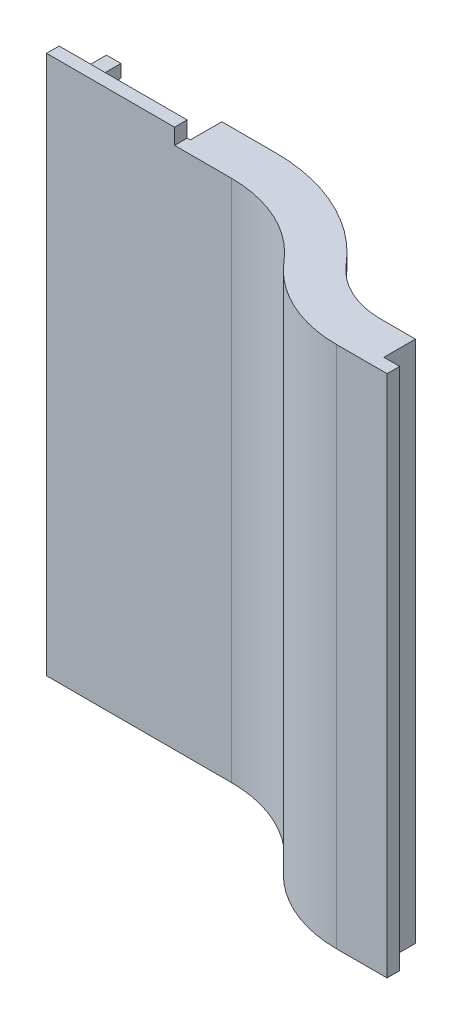
ISO-10303-21;
HEADER;
FILE_DESCRIPTION(('STEP AP214'),'2;1');
FILE_NAME('part.step','',(''),(''),'','','');
FILE_SCHEMA(('AUTOMOTIVE_DESIGN { 1 0 10303 214 1 1 1 1 }'));
ENDSEC;
DATA;
#1=APPLICATION_CONTEXT('core data for automotive mechanical design processes');
#2=APPLICATION_PROTOCOL_DEFINITION('international standard','automotive_design',2000,#1);
#3=PRODUCT_CONTEXT('',#1,'mechanical');
#4=PRODUCT('Part','Part','',(#3));
#5=PRODUCT_RELATED_PRODUCT_CATEGORY('part','',(#4));
#6=PRODUCT_DEFINITION_FORMATION('','',#4);
#7=PRODUCT_DEFINITION_CONTEXT('part definition',#1,'design');
#8=PRODUCT_DEFINITION('design','',#6,#7);
#9=PRODUCT_DEFINITION_SHAPE('','',#8);
#10=(LENGTH_UNIT() NAMED_UNIT(*) SI_UNIT(.MILLI.,.METRE.));
#11=(NAMED_UNIT(*) PLANE_ANGLE_UNIT() SI_UNIT($,.RADIAN.));
#12=(NAMED_UNIT(*) SI_UNIT($,.STERADIAN.) SOLID_ANGLE_UNIT());
#13=UNCERTAINTY_MEASURE_WITH_UNIT(LENGTH_MEASURE(1.E-05),#10,'distance_accuracy_value','');
#14=(GEOMETRIC_REPRESENTATION_CONTEXT(3) GLOBAL_UNCERTAINTY_ASSIGNED_CONTEXT((#13)) GLOBAL_UNIT_ASSIGNED_CONTEXT((#10,
#11,#12)) REPRESENTATION_CONTEXT('',''));
#15=CARTESIAN_POINT('',(0.,0.,0.));
#16=DIRECTION('',(0.,0.,1.));
#17=DIRECTION('',(1.,0.,0.));
#18=AXIS2_PLACEMENT_3D('',#15,#16,#17);
#19=CARTESIAN_POINT('',(-3.,80.5,151.017935777165));
#20=DIRECTION('',(0.,-1.,0.));
#21=DIRECTION('',(0.,0.,-1.));
#22=AXIS2_PLACEMENT_3D('',#19,#20,#21);
#23=PLANE('',#22);
#24=DIRECTION('',(-1.,0.,0.));
#25=VECTOR('',#24,1.);
#26=CARTESIAN_POINT('',(15.3,80.5,18.));
#27=LINE('',#26,#25);
#28=CARTESIAN_POINT('',(-0.199999999999999,80.5,18.));
#29=VERTEX_POINT('',#28);
#30=CARTESIAN_POINT('',(-2.5,80.5,18.));
#31=VERTEX_POINT('',#30);
#32=EDGE_CURVE('E37',#29,#31,#27,.T.);
#33=ORIENTED_EDGE('',*,*,#32,.F.);
#34=DIRECTION('',(0.,0.,1.));
#35=VECTOR('',#34,1.);
#36=CARTESIAN_POINT('',(-0.2,80.5,13.));
#37=LINE('',#36,#35);
#38=CARTESIAN_POINT('',(-0.2,80.5,13.));
#39=VERTEX_POINT('',#38);
#40=EDGE_CURVE('E58',#39,#29,#37,.T.);
#41=ORIENTED_EDGE('',*,*,#40,.F.);
#42=DIRECTION('',(1.,0.,0.));
#43=VECTOR('',#42,1.);
#44=CARTESIAN_POINT('',(-2.5,80.5,13.));
#45=LINE('',#44,#43);
#46=CARTESIAN_POINT('',(-2.5,80.5,13.));
#47=VERTEX_POINT('',#46);
#48=EDGE_CURVE('E531',#47,#39,#45,.T.);
#49=ORIENTED_EDGE('',*,*,#48,.F.);
#50=DIRECTION('',(0.,0.,1.));
#51=VECTOR('',#50,1.);
#52=CARTESIAN_POINT('',(-2.5,80.5,13.));
#53=LINE('',#52,#51);
#54=EDGE_CURVE('E506',#47,#31,#53,.T.);
#55=ORIENTED_EDGE('',*,*,#54,.T.);
#56=EDGE_LOOP('',(#33,#41,#49,#55));
#57=FACE_BOUND('',#56,.T.);
#58=ADVANCED_FACE('F33',(#57),#23,.F.);
#59=CARTESIAN_POINT('',(-0.499999999881593,78.5,500000.));
#60=DIRECTION('',(0.,1.,0.));
#61=DIRECTION('',(0.,0.,1.));
#62=AXIS2_PLACEMENT_3D('',#59,#60,#61);
#63=PLANE('',#62);
#64=DIRECTION('',(1.,0.,0.));
#65=VECTOR('',#64,1.);
#66=CARTESIAN_POINT('',(-0.500000000000001,78.5,13.));
#67=LINE('',#66,#65);
#68=CARTESIAN_POINT('',(-0.500000000000001,78.5,13.));
#69=VERTEX_POINT('',#68);
#70=CARTESIAN_POINT('',(-0.2,78.5,13.));
#71=VERTEX_POINT('',#70);
#72=EDGE_CURVE('E564',#69,#71,#67,.T.);
#73=ORIENTED_EDGE('',*,*,#72,.T.);
#74=DIRECTION('',(0.,0.,1.));
#75=VECTOR('',#74,1.);
#76=CARTESIAN_POINT('',(-0.199999999864478,78.5,500000.));
#77=LINE('',#76,#75);
#78=CARTESIAN_POINT('',(-0.199999999999999,78.5,18.));
#79=VERTEX_POINT('',#78);
#80=EDGE_CURVE('E305',#71,#79,#77,.T.);
#81=ORIENTED_EDGE('',*,*,#80,.T.);
#82=DIRECTION('',(1.,0.,0.));
#83=VECTOR('',#82,1.);
#84=CARTESIAN_POINT('',(-0.5,78.5,18.));
#85=LINE('',#84,#83);
#86=CARTESIAN_POINT('',(-0.5,78.5,18.));
#87=VERTEX_POINT('',#86);
#88=EDGE_CURVE('E573',#87,#79,#85,.T.);
#89=ORIENTED_EDGE('',*,*,#88,.F.);
#90=DIRECTION('',(0.,0.,1.));
#91=VECTOR('',#90,1.);
#92=CARTESIAN_POINT('',(-0.500000000000001,78.5,13.));
#93=LINE('',#92,#91);
#94=EDGE_CURVE('E534',#69,#87,#93,.T.);
#95=ORIENTED_EDGE('',*,*,#94,.F.);
#96=EDGE_LOOP('',(#73,#81,#89,#95));
#97=FACE_BOUND('',#96,.T.);
#98=ADVANCED_FACE('F604',(#97),#63,.F.);
#99=CARTESIAN_POINT('',(59.0000000001184,-0.499999999999988,500000.));
#100=DIRECTION('',(0.,-1.,0.));
#101=DIRECTION('',(1.,0.,0.));
#102=AXIS2_PLACEMENT_3D('',#99,#100,#101);
#103=PLANE('',#102);
#104=DIRECTION('',(-1.,0.,0.));
#105=VECTOR('',#104,1.);
#106=CARTESIAN_POINT('',(59.,-0.499999999999988,18.));
#107=LINE('',#106,#105);
#108=CARTESIAN_POINT('',(-0.199999999999999,-0.5,18.));
#109=VERTEX_POINT('',#108);
#110=CARTESIAN_POINT('',(-0.5,-0.5,18.));
#111=VERTEX_POINT('',#110);
#112=EDGE_CURVE('E575',#109,#111,#107,.T.);
#113=ORIENTED_EDGE('',*,*,#112,.F.);
#114=DIRECTION('',(0.,0.,-1.));
#115=VECTOR('',#114,1.);
#116=CARTESIAN_POINT('',(-0.199999999864475,-0.499999999999997,500000.));
#117=LINE('',#116,#115);
#118=CARTESIAN_POINT('',(-0.2,-0.499999999999995,13.));
#119=VERTEX_POINT('',#118);
#120=EDGE_CURVE('E302',#109,#119,#117,.T.);
#121=ORIENTED_EDGE('',*,*,#120,.T.);
#122=DIRECTION('',(-1.,0.,0.));
#123=VECTOR('',#122,1.);
#124=CARTESIAN_POINT('',(59.,-0.499999999999988,13.));
#125=LINE('',#124,#123);
#126=CARTESIAN_POINT('',(-0.500000000000001,-0.499999999999997,13.));
#127=VERTEX_POINT('',#126);
#128=EDGE_CURVE('E567',#119,#127,#125,.T.);
#129=ORIENTED_EDGE('',*,*,#128,.T.);
#130=DIRECTION('',(0.,0.,1.));
#131=VECTOR('',#130,1.);
#132=CARTESIAN_POINT('',(-0.500000000000001,-0.499999999999997,13.));
#133=LINE('',#132,#131);
#134=EDGE_CURVE('E530',#127,#111,#133,.T.);
#135=ORIENTED_EDGE('',*,*,#134,.T.);
#136=EDGE_LOOP('',(#113,#121,#129,#135));
#137=FACE_BOUND('',#136,.T.);
#138=ADVANCED_FACE('F598',(#137),#103,.F.);
#139=CARTESIAN_POINT('',(0.,0.,13.));
#140=DIRECTION('',(0.,0.,-1.));
#141=DIRECTION('',(-1.,0.,0.));
#142=AXIS2_PLACEMENT_3D('',#139,#140,#141);
#143=PLANE('',#142);
#144=DIRECTION('',(0.,1.,0.));
#145=VECTOR('',#144,1.);
#146=CARTESIAN_POINT('',(-0.2,-5.,13.));
#147=LINE('',#146,#145);
#148=CARTESIAN_POINT('',(-0.2,-2.5,13.));
#149=VERTEX_POINT('',#148);
#150=EDGE_CURVE('E288',#149,#119,#147,.T.);
#151=ORIENTED_EDGE('',*,*,#150,.F.);
#152=DIRECTION('',(-1.,0.,0.));
#153=VECTOR('',#152,1.);
#154=CARTESIAN_POINT('',(61.,-2.49999999999999,13.));
#155=LINE('',#154,#153);
#156=CARTESIAN_POINT('',(-2.5,-2.5,13.));
#157=VERTEX_POINT('',#156);
#158=EDGE_CURVE('E546',#149,#157,#155,.T.);
#159=ORIENTED_EDGE('',*,*,#158,.T.);
#160=DIRECTION('',(0.,1.,0.));
#161=VECTOR('',#160,1.);
#162=CARTESIAN_POINT('',(-2.5,-2.5,13.));
#163=LINE('',#162,#161);
#164=EDGE_CURVE('E512',#157,#47,#163,.T.);
#165=ORIENTED_EDGE('',*,*,#164,.T.);
#166=ORIENTED_EDGE('',*,*,#48,.T.);
#167=EDGE_CURVE('E289',#71,#39,#147,.T.);
#168=ORIENTED_EDGE('',*,*,#167,.F.);
#169=ORIENTED_EDGE('',*,*,#72,.F.);
#170=DIRECTION('',(0.,1.,0.));
#171=VECTOR('',#170,1.);
#172=CARTESIAN_POINT('',(-0.500000000000001,-0.499999999999997,13.));
#173=LINE('',#172,#171);
#174=EDGE_CURVE('E541',#127,#69,#173,.T.);
#175=ORIENTED_EDGE('',*,*,#174,.F.);
#176=ORIENTED_EDGE('',*,*,#128,.F.);
#177=EDGE_LOOP('',(#151,#159,#165,#166,#168,#169,#175,#176));
#178=FACE_BOUND('',#177,.T.);
#179=ADVANCED_FACE('F549',(#178),#143,.T.);
#180=DIRECTION('',(0.,1.,0.));
#181=VECTOR('',#180,1.);
#182=CARTESIAN_POINT('',(15.8,-5.,13.));
#183=LINE('',#182,#181);
#184=CARTESIAN_POINT('',(15.8,78.5,13.));
#185=VERTEX_POINT('',#184);
#186=CARTESIAN_POINT('',(15.8,80.5,13.));
#187=VERTEX_POINT('',#186);
#188=EDGE_CURVE('E292',#185,#187,#183,.T.);
#189=ORIENTED_EDGE('',*,*,#188,.T.);
#190=CARTESIAN_POINT('',(24.3,80.5,13.));
#191=VERTEX_POINT('',#190);
#192=EDGE_CURVE('E281',#187,#191,#45,.T.);
#193=ORIENTED_EDGE('',*,*,#192,.T.);
#194=DIRECTION('',(0.,-1.,0.));
#195=VECTOR('',#194,1.);
#196=CARTESIAN_POINT('',(24.3,83.000025,13.));
#197=LINE('',#196,#195);
#198=CARTESIAN_POINT('',(24.3,78.5,13.));
#199=VERTEX_POINT('',#198);
#200=EDGE_CURVE('E43',#191,#199,#197,.T.);
#201=ORIENTED_EDGE('',*,*,#200,.T.);
#202=EDGE_CURVE('E568',#185,#199,#67,.T.);
#203=ORIENTED_EDGE('',*,*,#202,.F.);
#204=EDGE_LOOP('',(#189,#193,#201,#203));
#205=FACE_BOUND('',#204,.T.);
#206=ADVANCED_FACE('F589',(#205),#143,.T.);
#207=DIRECTION('',(0.,0.,-1.));
#208=VECTOR('',#207,1.);
#209=CARTESIAN_POINT('',(15.8,80.5,18.));
#210=LINE('',#209,#208);
#211=CARTESIAN_POINT('',(15.8,80.5,18.));
#212=VERTEX_POINT('',#211);
#213=EDGE_CURVE('E259',#212,#187,#210,.T.);
#214=ORIENTED_EDGE('',*,*,#213,.F.);
#215=DIRECTION('',(1.,0.,0.));
#216=VECTOR('',#215,1.);
#217=CARTESIAN_POINT('',(15.8,80.5,18.));
#218=LINE('',#217,#216);
#219=CARTESIAN_POINT('',(15.3,80.5,18.));
#220=VERTEX_POINT('',#219);
#221=EDGE_CURVE('E268',#220,#212,#218,.T.);
#222=ORIENTED_EDGE('',*,*,#221,.F.);
#223=DIRECTION('',(0.,0.,-1.));
#224=VECTOR('',#223,1.);
#225=CARTESIAN_POINT('',(15.3,80.5,20.));
#226=LINE('',#225,#224);
#227=CARTESIAN_POINT('',(15.3,80.5,20.));
#228=VERTEX_POINT('',#227);
#229=EDGE_CURVE('E349',#228,#220,#226,.T.);
#230=ORIENTED_EDGE('',*,*,#229,.F.);
#231=DIRECTION('',(-1.,0.,0.));
#232=VECTOR('',#231,1.);
#233=CARTESIAN_POINT('',(24.3,80.5,20.));
#234=LINE('',#233,#232);
#235=CARTESIAN_POINT('',(24.3,80.5,20.));
#236=VERTEX_POINT('',#235);
#237=EDGE_CURVE('E437',#236,#228,#234,.T.);
#238=ORIENTED_EDGE('',*,*,#237,.F.);
#239=CARTESIAN_POINT('',(24.3,80.5,40.408448275862));
#240=DIRECTION('',(0.,-1.,0.));
#241=DIRECTION('',(0.,0.,-1.));
#242=AXIS2_PLACEMENT_3D('',#239,#240,#241);
#243=CIRCLE('',#242,20.408448275862);
#244=CARTESIAN_POINT('',(39.9,80.5,27.25));
#245=VERTEX_POINT('',#244);
#246=EDGE_CURVE('E434',#245,#236,#243,.F.);
#247=ORIENTED_EDGE('',*,*,#246,.F.);
#248=CARTESIAN_POINT('',(55.5,80.5,14.0915517241379));
#249=DIRECTION('',(0.,-1.,0.));
#250=DIRECTION('',(0.,0.,-1.));
#251=AXIS2_PLACEMENT_3D('',#248,#249,#250);
#252=CIRCLE('',#251,20.408448275862);
#253=CARTESIAN_POINT('',(55.4999999999999,80.5,34.5));
#254=VERTEX_POINT('',#253);
#255=EDGE_CURVE('E370',#254,#245,#252,.T.);
#256=ORIENTED_EDGE('',*,*,#255,.F.);
#257=DIRECTION('',(-1.,0.,0.));
#258=VECTOR('',#257,1.);
#259=CARTESIAN_POINT('',(55.4999999999999,80.5,34.5));
#260=LINE('',#259,#258);
#261=CARTESIAN_POINT('',(63.5,80.5,34.5));
#262=VERTEX_POINT('',#261);
#263=EDGE_CURVE('E377',#262,#254,#260,.T.);
#264=ORIENTED_EDGE('',*,*,#263,.F.);
#265=DIRECTION('',(0.,0.,1.));
#266=VECTOR('',#265,1.);
#267=CARTESIAN_POINT('',(63.5,80.5,32.5));
#268=LINE('',#267,#266);
#269=CARTESIAN_POINT('',(63.5,80.5,32.5));
#270=VERTEX_POINT('',#269);
#271=EDGE_CURVE('E383',#270,#262,#268,.T.);
#272=ORIENTED_EDGE('',*,*,#271,.F.);
#273=DIRECTION('',(1.,0.,0.));
#274=VECTOR('',#273,1.);
#275=CARTESIAN_POINT('',(55.4999999999999,80.5,32.5));
#276=LINE('',#275,#274);
#277=CARTESIAN_POINT('',(61.,80.5,32.5));
#278=VERTEX_POINT('',#277);
#279=EDGE_CURVE('E440',#278,#270,#276,.T.);
#280=ORIENTED_EDGE('',*,*,#279,.F.);
#281=DIRECTION('',(0.,0.,-1.));
#282=VECTOR('',#281,1.);
#283=CARTESIAN_POINT('',(61.0000000001184,80.5,500000.));
#284=LINE('',#283,#282);
#285=CARTESIAN_POINT('',(61.,80.5,27.5));
#286=VERTEX_POINT('',#285);
#287=EDGE_CURVE('E476',#278,#286,#284,.T.);
#288=ORIENTED_EDGE('',*,*,#287,.T.);
#289=DIRECTION('',(1.,0.,0.));
#290=VECTOR('',#289,1.);
#291=CARTESIAN_POINT('',(-3.,80.5,27.5));
#292=LINE('',#291,#290);
#293=CARTESIAN_POINT('',(55.4999999999999,80.5,27.5));
#294=VERTEX_POINT('',#293);
#295=EDGE_CURVE('E341',#294,#286,#292,.T.);
#296=ORIENTED_EDGE('',*,*,#295,.F.);
#297=CARTESIAN_POINT('',(55.5,80.5,14.0915517241379));
#298=DIRECTION('',(0.,-1.,0.));
#299=DIRECTION('',(0.,0.,-1.));
#300=AXIS2_PLACEMENT_3D('',#297,#298,#299);
#301=CIRCLE('',#300,13.4084482758621);
#302=CARTESIAN_POINT('',(45.2507252743539,80.5,22.736715271735));
#303=VERTEX_POINT('',#302);
#304=EDGE_CURVE('E346',#294,#303,#301,.T.);
#305=ORIENTED_EDGE('',*,*,#304,.T.);
#306=CARTESIAN_POINT('',(24.3,80.5,40.408448275862));
#307=DIRECTION('',(0.,-1.,0.));
#308=DIRECTION('',(0.,0.,-1.));
#309=AXIS2_PLACEMENT_3D('',#306,#307,#308);
#310=CIRCLE('',#309,27.408448275862);
#311=EDGE_CURVE('E333',#191,#303,#310,.T.);
#312=ORIENTED_EDGE('',*,*,#311,.F.);
#313=ORIENTED_EDGE('',*,*,#192,.F.);
#314=EDGE_LOOP('',(#214,#222,#230,#238,#247,#256,#264,#272,#280,#288,#296,#305,#312,#313));
#315=FACE_BOUND('',#314,.T.);
#316=ADVANCED_FACE('F279',(#315),#23,.F.);
#317=CARTESIAN_POINT('',(55.5,-2.49999999999999,14.0915517241379));
#318=DIRECTION('',(0.,1.,0.));
#319=DIRECTION('',(-1.,0.,0.));
#320=AXIS2_PLACEMENT_3D('',#317,#318,#319);
#321=PLANE('',#320);
#322=ORIENTED_EDGE('',*,*,#158,.F.);
#323=DIRECTION('',(0.,0.,1.));
#324=VECTOR('',#323,1.);
#325=CARTESIAN_POINT('',(-0.199999999999999,-2.5,14.091551724138));
#326=LINE('',#325,#324);
#327=CARTESIAN_POINT('',(-0.199999999999999,-2.5,18.));
#328=VERTEX_POINT('',#327);
#329=EDGE_CURVE('E308',#149,#328,#326,.T.);
#330=ORIENTED_EDGE('',*,*,#329,.T.);
#331=DIRECTION('',(1.,0.,0.));
#332=VECTOR('',#331,1.);
#333=CARTESIAN_POINT('',(55.5,-2.49999999999999,18.));
#334=LINE('',#333,#332);
#335=CARTESIAN_POINT('',(15.8,-2.5,18.));
#336=VERTEX_POINT('',#335);
#337=EDGE_CURVE('E294',#328,#336,#334,.T.);
#338=ORIENTED_EDGE('',*,*,#337,.T.);
#339=DIRECTION('',(0.,0.,-1.));
#340=VECTOR('',#339,1.);
#341=CARTESIAN_POINT('',(15.8,-2.5,14.0915517241379));
#342=LINE('',#341,#340);
#343=CARTESIAN_POINT('',(15.8,-2.5,13.));
#344=VERTEX_POINT('',#343);
#345=EDGE_CURVE('E299',#336,#344,#342,.T.);
#346=ORIENTED_EDGE('',*,*,#345,.T.);
#347=CARTESIAN_POINT('',(24.3,-2.5,13.));
#348=VERTEX_POINT('',#347);
#349=EDGE_CURVE('E518',#348,#344,#155,.T.);
#350=ORIENTED_EDGE('',*,*,#349,.F.);
#351=CARTESIAN_POINT('',(24.3,-2.5,40.408448275862));
#352=DIRECTION('',(0.,-1.,0.));
#353=DIRECTION('',(1.,0.,0.));
#354=AXIS2_PLACEMENT_3D('',#351,#352,#353);
#355=CIRCLE('',#354,27.408448275862);
#356=CARTESIAN_POINT('',(45.2507252743539,-2.49999999999999,22.736715271735));
#357=VERTEX_POINT('',#356);
#358=EDGE_CURVE('E317',#348,#357,#355,.T.);
#359=ORIENTED_EDGE('',*,*,#358,.T.);
#360=CARTESIAN_POINT('',(55.5,-2.49999999999999,14.0915517241379));
#361=DIRECTION('',(0.,-1.,0.));
#362=DIRECTION('',(1.,0.,0.));
#363=AXIS2_PLACEMENT_3D('',#360,#361,#362);
#364=CIRCLE('',#363,13.4084482758621);
#365=CARTESIAN_POINT('',(55.5,-2.49999999999999,27.5));
#366=VERTEX_POINT('',#365);
#367=EDGE_CURVE('E314',#366,#357,#364,.T.);
#368=ORIENTED_EDGE('',*,*,#367,.F.);
#369=DIRECTION('',(1.,0.,0.));
#370=VECTOR('',#369,1.);
#371=CARTESIAN_POINT('',(0.,-2.5,27.5));
#372=LINE('',#371,#370);
#373=CARTESIAN_POINT('',(61.,-2.49999999999999,27.5));
#374=VERTEX_POINT('',#373);
#375=EDGE_CURVE('E311',#366,#374,#372,.T.);
#376=ORIENTED_EDGE('',*,*,#375,.T.);
#377=DIRECTION('',(0.,0.,-1.));
#378=VECTOR('',#377,1.);
#379=CARTESIAN_POINT('',(61.0000000001184,-2.49999999999999,500000.));
#380=LINE('',#379,#378);
#381=CARTESIAN_POINT('',(61.,-2.49999999999999,32.5));
#382=VERTEX_POINT('',#381);
#383=EDGE_CURVE('E468',#382,#374,#380,.T.);
#384=ORIENTED_EDGE('',*,*,#383,.F.);
#385=DIRECTION('',(-1.,0.,0.));
#386=VECTOR('',#385,1.);
#387=CARTESIAN_POINT('',(55.5,-2.49999999999999,32.5));
#388=LINE('',#387,#386);
#389=CARTESIAN_POINT('',(63.5,-2.49999999999999,32.5));
#390=VERTEX_POINT('',#389);
#391=EDGE_CURVE('E397',#390,#382,#388,.T.);
#392=ORIENTED_EDGE('',*,*,#391,.F.);
#393=DIRECTION('',(0.,0.,-1.));
#394=VECTOR('',#393,1.);
#395=CARTESIAN_POINT('',(63.5,-2.49999999999999,32.5));
#396=LINE('',#395,#394);
#397=CARTESIAN_POINT('',(63.5,-2.49999999999999,34.5));
#398=VERTEX_POINT('',#397);
#399=EDGE_CURVE('E394',#398,#390,#396,.T.);
#400=ORIENTED_EDGE('',*,*,#399,.F.);
#401=DIRECTION('',(1.,0.,0.));
#402=VECTOR('',#401,1.);
#403=CARTESIAN_POINT('',(55.5,-2.49999999999999,34.5));
#404=LINE('',#403,#402);
#405=CARTESIAN_POINT('',(55.5,-2.49999999999999,34.5));
#406=VERTEX_POINT('',#405);
#407=EDGE_CURVE('E390',#406,#398,#404,.T.);
#408=ORIENTED_EDGE('',*,*,#407,.F.);
#409=CARTESIAN_POINT('',(55.5,-2.49999999999999,14.0915517241379));
#410=DIRECTION('',(0.,1.,0.));
#411=DIRECTION('',(-1.,0.,0.));
#412=AXIS2_PLACEMENT_3D('',#409,#410,#411);
#413=CIRCLE('',#412,20.408448275862);
#414=CARTESIAN_POINT('',(39.9,-2.49999999999999,27.25));
#415=VERTEX_POINT('',#414);
#416=EDGE_CURVE('E387',#415,#406,#413,.T.);
#417=ORIENTED_EDGE('',*,*,#416,.F.);
#418=CARTESIAN_POINT('',(24.3,-2.49999999999999,40.408448275862));
#419=DIRECTION('',(0.,-1.,0.));
#420=DIRECTION('',(-1.,0.,0.));
#421=AXIS2_PLACEMENT_3D('',#418,#419,#420);
#422=CIRCLE('',#421,20.408448275862);
#423=CARTESIAN_POINT('',(24.3,-2.49999999999999,20.));
#424=VERTEX_POINT('',#423);
#425=EDGE_CURVE('E407',#424,#415,#422,.T.);
#426=ORIENTED_EDGE('',*,*,#425,.F.);
#427=DIRECTION('',(1.,0.,0.));
#428=VECTOR('',#427,1.);
#429=CARTESIAN_POINT('',(24.3,-2.49999999999999,20.));
#430=LINE('',#429,#428);
#431=CARTESIAN_POINT('',(-5.,-2.5,20.));
#432=VERTEX_POINT('',#431);
#433=EDGE_CURVE('E404',#432,#424,#430,.T.);
#434=ORIENTED_EDGE('',*,*,#433,.F.);
#435=DIRECTION('',(0.,0.,1.));
#436=VECTOR('',#435,1.);
#437=CARTESIAN_POINT('',(-5.,-2.5,18.));
#438=LINE('',#437,#436);
#439=CARTESIAN_POINT('',(-5.,-2.5,18.));
#440=VERTEX_POINT('',#439);
#441=EDGE_CURVE('E401',#440,#432,#438,.T.);
#442=ORIENTED_EDGE('',*,*,#441,.F.);
#443=DIRECTION('',(-1.,0.,0.));
#444=VECTOR('',#443,1.);
#445=CARTESIAN_POINT('',(24.3,-2.49999999999999,18.));
#446=LINE('',#445,#444);
#447=CARTESIAN_POINT('',(-2.5,-2.5,18.));
#448=VERTEX_POINT('',#447);
#449=EDGE_CURVE('E399',#448,#440,#446,.T.);
#450=ORIENTED_EDGE('',*,*,#449,.F.);
#451=DIRECTION('',(0.,0.,1.));
#452=VECTOR('',#451,1.);
#453=CARTESIAN_POINT('',(-2.5,-2.5,13.));
#454=LINE('',#453,#452);
#455=EDGE_CURVE('E483',#157,#448,#454,.T.);
#456=ORIENTED_EDGE('',*,*,#455,.F.);
#457=EDGE_LOOP('',(#322,#330,#338,#346,#350,#359,#368,#376,#384,#392,#400,#408,#417,#426,#434,
#442,#450,#456));
#458=FACE_BOUND('',#457,.T.);
#459=ADVANCED_FACE('F465',(#458),#321,.F.);
#460=CARTESIAN_POINT('',(15.8,78.5,18.));
#461=VERTEX_POINT('',#460);
#462=CARTESIAN_POINT('',(24.3,78.5,18.));
#463=VERTEX_POINT('',#462);
#464=EDGE_CURVE('E359',#461,#463,#85,.T.);
#465=ORIENTED_EDGE('',*,*,#464,.F.);
#466=DIRECTION('',(0.,0.,-1.));
#467=VECTOR('',#466,1.);
#468=CARTESIAN_POINT('',(15.8,78.5,500000.));
#469=LINE('',#468,#467);
#470=EDGE_CURVE('E262',#461,#185,#469,.T.);
#471=ORIENTED_EDGE('',*,*,#470,.T.);
#472=ORIENTED_EDGE('',*,*,#202,.T.);
#473=CARTESIAN_POINT('',(24.3,78.5,40.408448275862));
#474=DIRECTION('',(0.,1.,0.));
#475=DIRECTION('',(0.,0.,1.));
#476=AXIS2_PLACEMENT_3D('',#473,#474,#475);
#477=CIRCLE('',#476,27.408448275862);
#478=CARTESIAN_POINT('',(45.2507252743539,78.5,22.736715271735));
#479=VERTEX_POINT('',#478);
#480=EDGE_CURVE('E330',#479,#199,#477,.T.);
#481=ORIENTED_EDGE('',*,*,#480,.F.);
#482=CARTESIAN_POINT('',(55.5,78.5,14.0915517241379));
#483=DIRECTION('',(0.,1.,0.));
#484=DIRECTION('',(0.,0.,1.));
#485=AXIS2_PLACEMENT_3D('',#482,#483,#484);
#486=CIRCLE('',#485,13.4084482758621);
#487=CARTESIAN_POINT('',(55.4999999999999,78.5,27.5));
#488=VERTEX_POINT('',#487);
#489=EDGE_CURVE('E343',#479,#488,#486,.T.);
#490=ORIENTED_EDGE('',*,*,#489,.T.);
#491=DIRECTION('',(-1.,0.,0.));
#492=VECTOR('',#491,1.);
#493=CARTESIAN_POINT('',(-0.499999999881593,78.5,27.499999999975));
#494=LINE('',#493,#492);
#495=CARTESIAN_POINT('',(59.,78.5,27.499999999975));
#496=VERTEX_POINT('',#495);
#497=EDGE_CURVE('E339',#496,#488,#494,.T.);
#498=ORIENTED_EDGE('',*,*,#497,.F.);
#499=DIRECTION('',(0.,0.,-1.));
#500=VECTOR('',#499,1.);
#501=CARTESIAN_POINT('',(59.0000000001184,78.5,500000.));
#502=LINE('',#501,#500);
#503=CARTESIAN_POINT('',(59.,78.5,32.5));
#504=VERTEX_POINT('',#503);
#505=EDGE_CURVE('E391',#504,#496,#502,.T.);
#506=ORIENTED_EDGE('',*,*,#505,.F.);
#507=DIRECTION('',(1.,0.,0.));
#508=VECTOR('',#507,1.);
#509=CARTESIAN_POINT('',(-0.499999999881593,78.5,32.5000000000273));
#510=LINE('',#509,#508);
#511=CARTESIAN_POINT('',(55.4999999999999,78.5,32.5));
#512=VERTEX_POINT('',#511);
#513=EDGE_CURVE('E477',#512,#504,#510,.T.);
#514=ORIENTED_EDGE('',*,*,#513,.F.);
#515=CARTESIAN_POINT('',(55.5,78.5,14.0915517241379));
#516=DIRECTION('',(0.,1.,0.));
#517=DIRECTION('',(0.,0.,1.));
#518=AXIS2_PLACEMENT_3D('',#515,#516,#517);
#519=CIRCLE('',#518,18.4084482758621);
#520=CARTESIAN_POINT('',(41.4287786498154,78.5,25.9604900776386));
#521=VERTEX_POINT('',#520);
#522=EDGE_CURVE('E480',#521,#512,#519,.T.);
#523=ORIENTED_EDGE('',*,*,#522,.F.);
#524=CARTESIAN_POINT('',(24.3,78.5,40.408448275862));
#525=DIRECTION('',(0.,1.,0.));
#526=DIRECTION('',(0.,0.,1.));
#527=AXIS2_PLACEMENT_3D('',#524,#525,#526);
#528=CIRCLE('',#527,22.408448275862);
#529=EDGE_CURVE('E493',#463,#521,#528,.F.);
#530=ORIENTED_EDGE('',*,*,#529,.F.);
#531=EDGE_LOOP('',(#465,#471,#472,#481,#490,#498,#506,#514,#523,#530));
#532=FACE_BOUND('',#531,.T.);
#533=ADVANCED_FACE('F582',(#532),#63,.F.);
#534=CARTESIAN_POINT('',(59.0000000001184,78.5,500000.));
#535=DIRECTION('',(1.,0.,0.));
#536=DIRECTION('',(0.,0.,-1.));
#537=AXIS2_PLACEMENT_3D('',#534,#535,#536);
#538=PLANE('',#537);
#539=DIRECTION('',(0.,1.,0.));
#540=VECTOR('',#539,1.);
#541=CARTESIAN_POINT('',(59.,78.5,27.499999999975));
#542=LINE('',#541,#540);
#543=CARTESIAN_POINT('',(59.,-0.499999999999988,27.499999999975));
#544=VERTEX_POINT('',#543);
#545=EDGE_CURVE('E337',#544,#496,#542,.T.);
#546=ORIENTED_EDGE('',*,*,#545,.F.);
#547=DIRECTION('',(0.,0.,-1.));
#548=VECTOR('',#547,1.);
#549=CARTESIAN_POINT('',(59.0000000001184,-0.499999999999988,500000.));
#550=LINE('',#549,#548);
#551=CARTESIAN_POINT('',(59.,-0.499999999999988,32.5000000000273));
#552=VERTEX_POINT('',#551);
#553=EDGE_CURVE('E487',#552,#544,#550,.T.);
#554=ORIENTED_EDGE('',*,*,#553,.F.);
#555=DIRECTION('',(0.,-1.,0.));
#556=VECTOR('',#555,1.);
#557=CARTESIAN_POINT('',(59.,78.5,32.5000000000273));
#558=LINE('',#557,#556);
#559=EDGE_CURVE('E446',#504,#552,#558,.T.);
#560=ORIENTED_EDGE('',*,*,#559,.F.);
#561=ORIENTED_EDGE('',*,*,#505,.T.);
#562=EDGE_LOOP('',(#546,#554,#560,#561));
#563=FACE_BOUND('',#562,.T.);
#564=ADVANCED_FACE('F697',(#563),#538,.F.);
#565=CARTESIAN_POINT('',(24.3,-0.499999999999987,13.));
#566=VERTEX_POINT('',#565);
#567=CARTESIAN_POINT('',(15.8,-0.499999999999995,13.));
#568=VERTEX_POINT('',#567);
#569=EDGE_CURVE('E569',#566,#568,#125,.T.);
#570=ORIENTED_EDGE('',*,*,#569,.T.);
#571=DIRECTION('',(0.,0.,1.));
#572=VECTOR('',#571,1.);
#573=CARTESIAN_POINT('',(15.8,-0.499999999999995,500000.));
#574=LINE('',#573,#572);
#575=CARTESIAN_POINT('',(15.8,-0.5,18.));
#576=VERTEX_POINT('',#575);
#577=EDGE_CURVE('E50',#568,#576,#574,.T.);
#578=ORIENTED_EDGE('',*,*,#577,.T.);
#579=CARTESIAN_POINT('',(24.3,-0.5,18.));
#580=VERTEX_POINT('',#579);
#581=EDGE_CURVE('E576',#580,#576,#107,.T.);
#582=ORIENTED_EDGE('',*,*,#581,.F.);
#583=CARTESIAN_POINT('',(24.3,-0.5,40.408448275862));
#584=DIRECTION('',(0.,-1.,0.));
#585=DIRECTION('',(1.,0.,0.));
#586=AXIS2_PLACEMENT_3D('',#583,#584,#585);
#587=CIRCLE('',#586,22.408448275862);
#588=CARTESIAN_POINT('',(41.4287786498154,-0.5,25.9604900776386));
#589=VERTEX_POINT('',#588);
#590=EDGE_CURVE('E498',#589,#580,#587,.F.);
#591=ORIENTED_EDGE('',*,*,#590,.F.);
#592=CARTESIAN_POINT('',(55.5,-0.5,14.0915517241379));
#593=DIRECTION('',(0.,-1.,0.));
#594=DIRECTION('',(1.,0.,0.));
#595=AXIS2_PLACEMENT_3D('',#592,#593,#594);
#596=CIRCLE('',#595,18.4084482758621);
#597=CARTESIAN_POINT('',(55.5,-0.5,32.5));
#598=VERTEX_POINT('',#597);
#599=EDGE_CURVE('E497',#598,#589,#596,.T.);
#600=ORIENTED_EDGE('',*,*,#599,.F.);
#601=DIRECTION('',(-1.,0.,0.));
#602=VECTOR('',#601,1.);
#603=CARTESIAN_POINT('',(59.0000000001184,-0.499999999999988,32.5000000000273));
#604=LINE('',#603,#602);
#605=EDGE_CURVE('E495',#552,#598,#604,.T.);
#606=ORIENTED_EDGE('',*,*,#605,.F.);
#607=ORIENTED_EDGE('',*,*,#553,.T.);
#608=DIRECTION('',(1.,0.,0.));
#609=VECTOR('',#608,1.);
#610=CARTESIAN_POINT('',(59.0000000001184,-0.499999999999988,27.499999999975));
#611=LINE('',#610,#609);
#612=CARTESIAN_POINT('',(55.5,-0.499999999999987,27.5));
#613=VERTEX_POINT('',#612);
#614=EDGE_CURVE('E335',#613,#544,#611,.T.);
#615=ORIENTED_EDGE('',*,*,#614,.F.);
#616=CARTESIAN_POINT('',(55.5,-0.499999999999987,14.0915517241379));
#617=DIRECTION('',(0.,-1.,0.));
#618=DIRECTION('',(1.,0.,0.));
#619=AXIS2_PLACEMENT_3D('',#616,#617,#618);
#620=CIRCLE('',#619,13.4084482758621);
#621=CARTESIAN_POINT('',(45.2507252743539,-0.499999999999987,22.736715271735));
#622=VERTEX_POINT('',#621);
#623=EDGE_CURVE('E11',#613,#622,#620,.T.);
#624=ORIENTED_EDGE('',*,*,#623,.T.);
#625=CARTESIAN_POINT('',(24.3,-0.499999999999987,40.408448275862));
#626=DIRECTION('',(0.,-1.,0.));
#627=DIRECTION('',(1.,0.,0.));
#628=AXIS2_PLACEMENT_3D('',#625,#626,#627);
#629=CIRCLE('',#628,27.408448275862);
#630=EDGE_CURVE('E323',#566,#622,#629,.T.);
#631=ORIENTED_EDGE('',*,*,#630,.F.);
#632=EDGE_LOOP('',(#570,#578,#582,#591,#600,#606,#607,#615,#624,#631));
#633=FACE_BOUND('',#632,.T.);
#634=ADVANCED_FACE('F701',(#633),#103,.F.);
#635=CARTESIAN_POINT('',(61.0000000001184,80.5,500000.));
#636=DIRECTION('',(1.,0.,0.));
#637=DIRECTION('',(0.,0.,-1.));
#638=AXIS2_PLACEMENT_3D('',#635,#636,#637);
#639=PLANE('',#638);
#640=ORIENTED_EDGE('',*,*,#383,.T.);
#641=DIRECTION('',(0.,-1.,0.));
#642=VECTOR('',#641,1.);
#643=CARTESIAN_POINT('',(61.,83.000025,27.5));
#644=LINE('',#643,#642);
#645=EDGE_CURVE('E321',#286,#374,#644,.T.);
#646=ORIENTED_EDGE('',*,*,#645,.F.);
#647=ORIENTED_EDGE('',*,*,#287,.F.);
#648=DIRECTION('',(0.,-1.,0.));
#649=VECTOR('',#648,1.);
#650=CARTESIAN_POINT('',(61.,80.5,32.5000000000273));
#651=LINE('',#650,#649);
#652=EDGE_CURVE('E472',#278,#382,#651,.T.);
#653=ORIENTED_EDGE('',*,*,#652,.T.);
#654=EDGE_LOOP('',(#640,#646,#647,#653));
#655=FACE_BOUND('',#654,.T.);
#656=ADVANCED_FACE('F474',(#655),#639,.T.);
#657=EDGE_CURVE('E291',#344,#568,#183,.T.);
#658=ORIENTED_EDGE('',*,*,#657,.T.);
#659=ORIENTED_EDGE('',*,*,#569,.F.);
#660=EDGE_CURVE('E368',#566,#348,#197,.T.);
#661=ORIENTED_EDGE('',*,*,#660,.T.);
#662=ORIENTED_EDGE('',*,*,#349,.T.);
#663=EDGE_LOOP('',(#658,#659,#661,#662));
#664=FACE_BOUND('',#663,.T.);
#665=ADVANCED_FACE('F592',(#664),#143,.T.);
#666=CARTESIAN_POINT('',(24.3,151.459208056861,40.408448275862));
#667=DIRECTION('',(0.,-1.,0.));
#668=DIRECTION('',(1.,0.,0.));
#669=AXIS2_PLACEMENT_3D('',#666,#667,#668);
#670=CYLINDRICAL_SURFACE('',#669,20.408448275862);
#671=DIRECTION('',(0.,-1.,0.));
#672=VECTOR('',#671,1.);
#673=CARTESIAN_POINT('',(39.9,151.459208056861,27.25));
#674=LINE('',#673,#672);
#675=EDGE_CURVE('E410',#245,#415,#674,.T.);
#676=ORIENTED_EDGE('',*,*,#675,.F.);
#677=ORIENTED_EDGE('',*,*,#246,.T.);
#678=DIRECTION('',(0.,-1.,0.));
#679=VECTOR('',#678,1.);
#680=CARTESIAN_POINT('',(24.3,151.459208056861,20.));
#681=LINE('',#680,#679);
#682=EDGE_CURVE('E412',#236,#424,#681,.T.);
#683=ORIENTED_EDGE('',*,*,#682,.T.);
#684=ORIENTED_EDGE('',*,*,#425,.T.);
#685=EDGE_LOOP('',(#676,#677,#683,#684));
#686=FACE_BOUND('',#685,.T.);
#687=ADVANCED_FACE('F602',(#686),#670,.F.);
#688=CARTESIAN_POINT('',(24.3,151.459208056861,20.));
#689=DIRECTION('',(0.,0.,-1.));
#690=DIRECTION('',(-1.,0.,0.));
#691=AXIS2_PLACEMENT_3D('',#688,#689,#690);
#692=PLANE('',#691);
#693=ORIENTED_EDGE('',*,*,#682,.F.);
#694=ORIENTED_EDGE('',*,*,#237,.T.);
#695=DIRECTION('',(0.,-1.,0.));
#696=VECTOR('',#695,1.);
#697=CARTESIAN_POINT('',(15.3,103.398284241573,20.));
#698=LINE('',#697,#696);
#699=CARTESIAN_POINT('',(15.3,83.,20.));
#700=VERTEX_POINT('',#699);
#701=EDGE_CURVE('E523',#700,#228,#698,.T.);
#702=ORIENTED_EDGE('',*,*,#701,.F.);
#703=DIRECTION('',(-1.,0.,0.));
#704=VECTOR('',#703,1.);
#705=CARTESIAN_POINT('',(15.3,83.,20.));
#706=LINE('',#705,#704);
#707=CARTESIAN_POINT('',(-5.00000000000002,83.,20.));
#708=VERTEX_POINT('',#707);
#709=EDGE_CURVE('E354',#700,#708,#706,.T.);
#710=ORIENTED_EDGE('',*,*,#709,.T.);
#711=DIRECTION('',(0.,-1.,0.));
#712=VECTOR('',#711,1.);
#713=CARTESIAN_POINT('',(-5.00000000000003,151.459208056861,20.));
#714=LINE('',#713,#712);
#715=EDGE_CURVE('E414',#708,#432,#714,.T.);
#716=ORIENTED_EDGE('',*,*,#715,.T.);
#717=ORIENTED_EDGE('',*,*,#433,.T.);
#718=EDGE_LOOP('',(#693,#694,#702,#710,#716,#717));
#719=FACE_BOUND('',#718,.T.);
#720=ADVANCED_FACE('F562',(#719),#692,.F.);
#721=CARTESIAN_POINT('',(-5.00000000000003,151.459208056861,18.));
#722=DIRECTION('',(1.,0.,0.));
#723=DIRECTION('',(0.,1.,0.));
#724=AXIS2_PLACEMENT_3D('',#721,#722,#723);
#725=PLANE('',#724);
#726=ORIENTED_EDGE('',*,*,#715,.F.);
#727=DIRECTION('',(0.,0.,-1.));
#728=VECTOR('',#727,1.);
#729=CARTESIAN_POINT('',(-5.00000000000002,83.,20.));
#730=LINE('',#729,#728);
#731=CARTESIAN_POINT('',(-5.00000000000002,83.,18.));
#732=VERTEX_POINT('',#731);
#733=EDGE_CURVE('E350',#708,#732,#730,.T.);
#734=ORIENTED_EDGE('',*,*,#733,.T.);
#735=DIRECTION('',(0.,-1.,0.));
#736=VECTOR('',#735,1.);
#737=CARTESIAN_POINT('',(-5.00000000000003,151.459208056861,18.));
#738=LINE('',#737,#736);
#739=EDGE_CURVE('E416',#732,#440,#738,.T.);
#740=ORIENTED_EDGE('',*,*,#739,.T.);
#741=ORIENTED_EDGE('',*,*,#441,.T.);
#742=EDGE_LOOP('',(#726,#734,#740,#741));
#743=FACE_BOUND('',#742,.T.);
#744=ADVANCED_FACE('F555',(#743),#725,.F.);
#745=CARTESIAN_POINT('',(55.4999999999999,151.459208056861,32.5));
#746=DIRECTION('',(0.,0.,1.));
#747=DIRECTION('',(1.,0.,0.));
#748=AXIS2_PLACEMENT_3D('',#745,#746,#747);
#749=PLANE('',#748);
#750=ORIENTED_EDGE('',*,*,#391,.T.);
#751=ORIENTED_EDGE('',*,*,#652,.F.);
#752=ORIENTED_EDGE('',*,*,#279,.T.);
#753=DIRECTION('',(0.,-1.,0.));
#754=VECTOR('',#753,1.);
#755=CARTESIAN_POINT('',(63.4999999999999,151.459208056861,32.5));
#756=LINE('',#755,#754);
#757=EDGE_CURVE('E428',#270,#390,#756,.T.);
#758=ORIENTED_EDGE('',*,*,#757,.T.);
#759=EDGE_LOOP('',(#750,#751,#752,#758));
#760=FACE_BOUND('',#759,.T.);
#761=ADVANCED_FACE('F471',(#760),#749,.F.);
#762=CARTESIAN_POINT('',(63.4999999999999,151.459208056861,32.5));
#763=DIRECTION('',(-1.,0.,0.));
#764=DIRECTION('',(0.,-1.,0.));
#765=AXIS2_PLACEMENT_3D('',#762,#763,#764);
#766=PLANE('',#765);
#767=ORIENTED_EDGE('',*,*,#757,.F.);
#768=ORIENTED_EDGE('',*,*,#271,.T.);
#769=DIRECTION('',(0.,-1.,0.));
#770=VECTOR('',#769,1.);
#771=CARTESIAN_POINT('',(63.4999999999999,151.459208056861,34.5));
#772=LINE('',#771,#770);
#773=EDGE_CURVE('E430',#262,#398,#772,.T.);
#774=ORIENTED_EDGE('',*,*,#773,.T.);
#775=ORIENTED_EDGE('',*,*,#399,.T.);
#776=EDGE_LOOP('',(#767,#768,#774,#775));
#777=FACE_BOUND('',#776,.T.);
#778=ADVANCED_FACE('F452',(#777),#766,.F.);
#779=CARTESIAN_POINT('',(55.4999999999999,151.459208056861,34.5));
#780=DIRECTION('',(0.,0.,-1.));
#781=DIRECTION('',(-1.,0.,0.));
#782=AXIS2_PLACEMENT_3D('',#779,#780,#781);
#783=PLANE('',#782);
#784=ORIENTED_EDGE('',*,*,#773,.F.);
#785=ORIENTED_EDGE('',*,*,#263,.T.);
#786=DIRECTION('',(0.,-1.,0.));
#787=VECTOR('',#786,1.);
#788=CARTESIAN_POINT('',(55.4999999999999,151.459208056861,34.5));
#789=LINE('',#788,#787);
#790=EDGE_CURVE('E432',#254,#406,#789,.T.);
#791=ORIENTED_EDGE('',*,*,#790,.T.);
#792=ORIENTED_EDGE('',*,*,#407,.T.);
#793=EDGE_LOOP('',(#784,#785,#791,#792));
#794=FACE_BOUND('',#793,.T.);
#795=ADVANCED_FACE('F458',(#794),#783,.F.);
#796=CARTESIAN_POINT('',(55.4999999999999,151.459208056861,14.0915517241379));
#797=DIRECTION('',(0.,-1.,0.));
#798=DIRECTION('',(1.,0.,0.));
#799=AXIS2_PLACEMENT_3D('',#796,#797,#798);
#800=CYLINDRICAL_SURFACE('',#799,20.408448275862);
#801=ORIENTED_EDGE('',*,*,#790,.F.);
#802=ORIENTED_EDGE('',*,*,#255,.T.);
#803=ORIENTED_EDGE('',*,*,#675,.T.);
#804=ORIENTED_EDGE('',*,*,#416,.T.);
#805=EDGE_LOOP('',(#801,#802,#803,#804));
#806=FACE_BOUND('',#805,.T.);
#807=ADVANCED_FACE('F35',(#806),#800,.T.);
#808=CARTESIAN_POINT('',(-2.5,-2.5,13.));
#809=DIRECTION('',(1.,0.,0.));
#810=DIRECTION('',(0.,0.,-1.));
#811=AXIS2_PLACEMENT_3D('',#808,#809,#810);
#812=PLANE('',#811);
#813=DIRECTION('',(0.,1.,0.));
#814=VECTOR('',#813,1.);
#815=CARTESIAN_POINT('',(-2.5,-2.5,18.));
#816=LINE('',#815,#814);
#817=EDGE_CURVE('E526',#448,#31,#816,.T.);
#818=ORIENTED_EDGE('',*,*,#817,.T.);
#819=ORIENTED_EDGE('',*,*,#54,.F.);
#820=ORIENTED_EDGE('',*,*,#164,.F.);
#821=ORIENTED_EDGE('',*,*,#455,.T.);
#822=EDGE_LOOP('',(#818,#819,#820,#821));
#823=FACE_BOUND('',#822,.T.);
#824=ADVANCED_FACE('F529',(#823),#812,.F.);
#825=CARTESIAN_POINT('',(-0.500000000000001,-0.499999999999997,13.));
#826=DIRECTION('',(1.,0.,0.));
#827=DIRECTION('',(0.,0.,-1.));
#828=AXIS2_PLACEMENT_3D('',#825,#826,#827);
#829=PLANE('',#828);
#830=DIRECTION('',(0.,1.,0.));
#831=VECTOR('',#830,1.);
#832=CARTESIAN_POINT('',(-0.5,-0.499999999999997,18.));
#833=LINE('',#832,#831);
#834=EDGE_CURVE('E577',#111,#87,#833,.T.);
#835=ORIENTED_EDGE('',*,*,#834,.F.);
#836=ORIENTED_EDGE('',*,*,#134,.F.);
#837=ORIENTED_EDGE('',*,*,#174,.T.);
#838=ORIENTED_EDGE('',*,*,#94,.T.);
#839=EDGE_LOOP('',(#835,#836,#837,#838));
#840=FACE_BOUND('',#839,.T.);
#841=ADVANCED_FACE('F643',(#840),#829,.T.);
#842=ORIENTED_EDGE('',*,*,#513,.T.);
#843=ORIENTED_EDGE('',*,*,#559,.T.);
#844=ORIENTED_EDGE('',*,*,#605,.T.);
#845=DIRECTION('',(0.,-1.,0.));
#846=VECTOR('',#845,1.);
#847=CARTESIAN_POINT('',(55.4999999999999,151.459208056861,32.5));
#848=LINE('',#847,#846);
#849=EDGE_CURVE('E425',#512,#598,#848,.T.);
#850=ORIENTED_EDGE('',*,*,#849,.F.);
#851=EDGE_LOOP('',(#842,#843,#844,#850));
#852=FACE_BOUND('',#851,.T.);
#853=ADVANCED_FACE('F631',(#852),#749,.F.);
#854=CARTESIAN_POINT('',(55.4999999999999,151.459208056861,14.0915517241379));
#855=DIRECTION('',(0.,-1.,0.));
#856=DIRECTION('',(1.,0.,0.));
#857=AXIS2_PLACEMENT_3D('',#854,#855,#856);
#858=CYLINDRICAL_SURFACE('',#857,18.4084482758621);
#859=ORIENTED_EDGE('',*,*,#522,.T.);
#860=ORIENTED_EDGE('',*,*,#849,.T.);
#861=ORIENTED_EDGE('',*,*,#599,.T.);
#862=DIRECTION('',(0.,-1.,0.));
#863=VECTOR('',#862,1.);
#864=CARTESIAN_POINT('',(41.4287786498154,151.459208056861,25.9604900776386));
#865=LINE('',#864,#863);
#866=EDGE_CURVE('E422',#521,#589,#865,.T.);
#867=ORIENTED_EDGE('',*,*,#866,.F.);
#868=EDGE_LOOP('',(#859,#860,#861,#867));
#869=FACE_BOUND('',#868,.T.);
#870=ADVANCED_FACE('F628',(#869),#858,.F.);
#871=CARTESIAN_POINT('',(24.3,151.459208056861,40.408448275862));
#872=DIRECTION('',(0.,-1.,0.));
#873=DIRECTION('',(1.,0.,0.));
#874=AXIS2_PLACEMENT_3D('',#871,#872,#873);
#875=CYLINDRICAL_SURFACE('',#874,22.408448275862);
#876=ORIENTED_EDGE('',*,*,#529,.T.);
#877=ORIENTED_EDGE('',*,*,#866,.T.);
#878=ORIENTED_EDGE('',*,*,#590,.T.);
#879=DIRECTION('',(0.,-1.,0.));
#880=VECTOR('',#879,1.);
#881=CARTESIAN_POINT('',(24.3,151.459208056861,18.));
#882=LINE('',#881,#880);
#883=EDGE_CURVE('E419',#463,#580,#882,.T.);
#884=ORIENTED_EDGE('',*,*,#883,.F.);
#885=EDGE_LOOP('',(#876,#877,#878,#884));
#886=FACE_BOUND('',#885,.T.);
#887=ADVANCED_FACE('F625',(#886),#875,.T.);
#888=CARTESIAN_POINT('',(24.3,151.459208056861,18.));
#889=DIRECTION('',(0.,0.,1.));
#890=DIRECTION('',(1.,0.,0.));
#891=AXIS2_PLACEMENT_3D('',#888,#889,#890);
#892=PLANE('',#891);
#893=ORIENTED_EDGE('',*,*,#581,.T.);
#894=DIRECTION('',(0.,1.,0.));
#895=VECTOR('',#894,1.);
#896=CARTESIAN_POINT('',(15.8,-5.,18.));
#897=LINE('',#896,#895);
#898=EDGE_CURVE('E265',#336,#576,#897,.T.);
#899=ORIENTED_EDGE('',*,*,#898,.F.);
#900=ORIENTED_EDGE('',*,*,#337,.F.);
#901=DIRECTION('',(0.,1.,0.));
#902=VECTOR('',#901,1.);
#903=CARTESIAN_POINT('',(-0.199999999999999,-5.,18.));
#904=LINE('',#903,#902);
#905=EDGE_CURVE('E287',#328,#109,#904,.T.);
#906=ORIENTED_EDGE('',*,*,#905,.T.);
#907=ORIENTED_EDGE('',*,*,#112,.T.);
#908=ORIENTED_EDGE('',*,*,#834,.T.);
#909=ORIENTED_EDGE('',*,*,#88,.T.);
#910=EDGE_CURVE('E285',#79,#29,#904,.T.);
#911=ORIENTED_EDGE('',*,*,#910,.T.);
#912=ORIENTED_EDGE('',*,*,#32,.T.);
#913=ORIENTED_EDGE('',*,*,#817,.F.);
#914=ORIENTED_EDGE('',*,*,#449,.T.);
#915=ORIENTED_EDGE('',*,*,#739,.F.);
#916=DIRECTION('',(1.,0.,0.));
#917=VECTOR('',#916,1.);
#918=CARTESIAN_POINT('',(15.3,83.,18.));
#919=LINE('',#918,#917);
#920=CARTESIAN_POINT('',(15.3,83.,18.));
#921=VERTEX_POINT('',#920);
#922=EDGE_CURVE('E353',#732,#921,#919,.T.);
#923=ORIENTED_EDGE('',*,*,#922,.T.);
#924=DIRECTION('',(0.,-1.,0.));
#925=VECTOR('',#924,1.);
#926=CARTESIAN_POINT('',(15.3,103.398284241573,18.));
#927=LINE('',#926,#925);
#928=EDGE_CURVE('E273',#921,#220,#927,.T.);
#929=ORIENTED_EDGE('',*,*,#928,.T.);
#930=ORIENTED_EDGE('',*,*,#221,.T.);
#931=EDGE_CURVE('E255',#461,#212,#897,.T.);
#932=ORIENTED_EDGE('',*,*,#931,.F.);
#933=ORIENTED_EDGE('',*,*,#464,.T.);
#934=ORIENTED_EDGE('',*,*,#883,.T.);
#935=EDGE_LOOP('',(#893,#899,#900,#906,#907,#908,#909,#911,#912,#913,#914,#915,#923,#929,#930,
#932,#933,#934));
#936=FACE_BOUND('',#935,.T.);
#937=ADVANCED_FACE('F270',(#936),#892,.F.);
#938=CARTESIAN_POINT('',(15.3,103.398284241573,20.));
#939=DIRECTION('',(-1.,0.,0.));
#940=DIRECTION('',(0.,0.,1.));
#941=AXIS2_PLACEMENT_3D('',#938,#939,#940);
#942=PLANE('',#941);
#943=ORIENTED_EDGE('',*,*,#928,.F.);
#944=DIRECTION('',(0.,0.,1.));
#945=VECTOR('',#944,1.);
#946=CARTESIAN_POINT('',(15.3,83.,20.));
#947=LINE('',#946,#945);
#948=EDGE_CURVE('E356',#921,#700,#947,.T.);
#949=ORIENTED_EDGE('',*,*,#948,.T.);
#950=ORIENTED_EDGE('',*,*,#701,.T.);
#951=ORIENTED_EDGE('',*,*,#229,.T.);
#952=EDGE_LOOP('',(#943,#949,#950,#951));
#953=FACE_BOUND('',#952,.T.);
#954=ADVANCED_FACE('F624',(#953),#942,.F.);
#955=CARTESIAN_POINT('',(62.,83.,-5.));
#956=DIRECTION('',(0.,-1.,0.));
#957=DIRECTION('',(0.,0.,-1.));
#958=AXIS2_PLACEMENT_3D('',#955,#956,#957);
#959=PLANE('',#958);
#960=ORIENTED_EDGE('',*,*,#922,.F.);
#961=ORIENTED_EDGE('',*,*,#733,.F.);
#962=ORIENTED_EDGE('',*,*,#709,.F.);
#963=ORIENTED_EDGE('',*,*,#948,.F.);
#964=EDGE_LOOP('',(#960,#961,#962,#963));
#965=FACE_BOUND('',#964,.T.);
#966=ADVANCED_FACE('F559',(#965),#959,.F.);
#967=CARTESIAN_POINT('',(55.5,83.000025,14.0915517241379));
#968=DIRECTION('',(0.,-1.,0.));
#969=DIRECTION('',(1.,0.,0.));
#970=AXIS2_PLACEMENT_3D('',#967,#968,#969);
#971=CYLINDRICAL_SURFACE('',#970,13.4084482758621);
#972=DIRECTION('',(0.,-1.,0.));
#973=VECTOR('',#972,1.);
#974=CARTESIAN_POINT('',(55.4999999999999,83.000025,27.5));
#975=LINE('',#974,#973);
#976=EDGE_CURVE('E327',#294,#488,#975,.T.);
#977=ORIENTED_EDGE('',*,*,#976,.T.);
#978=ORIENTED_EDGE('',*,*,#489,.F.);
#979=DIRECTION('',(0.,-1.,0.));
#980=VECTOR('',#979,1.);
#981=CARTESIAN_POINT('',(45.2507252743539,83.000025,22.736715271735));
#982=LINE('',#981,#980);
#983=EDGE_CURVE('E324',#303,#479,#982,.T.);
#984=ORIENTED_EDGE('',*,*,#983,.F.);
#985=ORIENTED_EDGE('',*,*,#304,.F.);
#986=EDGE_LOOP('',(#977,#978,#984,#985));
#987=FACE_BOUND('',#986,.T.);
#988=ADVANCED_FACE('F650',(#987),#971,.F.);
#989=EDGE_CURVE('E320',#613,#366,#975,.T.);
#990=ORIENTED_EDGE('',*,*,#989,.T.);
#991=ORIENTED_EDGE('',*,*,#367,.T.);
#992=EDGE_CURVE('E325',#622,#357,#982,.T.);
#993=ORIENTED_EDGE('',*,*,#992,.F.);
#994=ORIENTED_EDGE('',*,*,#623,.F.);
#995=EDGE_LOOP('',(#990,#991,#993,#994));
#996=FACE_BOUND('',#995,.T.);
#997=ADVANCED_FACE('F680',(#996),#971,.F.);
#998=CARTESIAN_POINT('',(0.,83.000025,27.5));
#999=DIRECTION('',(0.,0.,-1.));
#1000=DIRECTION('',(-1.,0.,0.));
#1001=AXIS2_PLACEMENT_3D('',#998,#999,#1000);
#1002=PLANE('',#1001);
#1003=ORIENTED_EDGE('',*,*,#295,.T.);
#1004=ORIENTED_EDGE('',*,*,#645,.T.);
#1005=ORIENTED_EDGE('',*,*,#375,.F.);
#1006=ORIENTED_EDGE('',*,*,#989,.F.);
#1007=ORIENTED_EDGE('',*,*,#614,.T.);
#1008=ORIENTED_EDGE('',*,*,#545,.T.);
#1009=ORIENTED_EDGE('',*,*,#497,.T.);
#1010=ORIENTED_EDGE('',*,*,#976,.F.);
#1011=EDGE_LOOP('',(#1003,#1004,#1005,#1006,#1007,#1008,#1009,#1010));
#1012=FACE_BOUND('',#1011,.T.);
#1013=ADVANCED_FACE('F678',(#1012),#1002,.T.);
#1014=CARTESIAN_POINT('',(24.3,83.000025,40.408448275862));
#1015=DIRECTION('',(0.,-1.,0.));
#1016=DIRECTION('',(1.,0.,0.));
#1017=AXIS2_PLACEMENT_3D('',#1014,#1015,#1016);
#1018=CYLINDRICAL_SURFACE('',#1017,27.408448275862);
#1019=ORIENTED_EDGE('',*,*,#311,.T.);
#1020=ORIENTED_EDGE('',*,*,#983,.T.);
#1021=ORIENTED_EDGE('',*,*,#480,.T.);
#1022=ORIENTED_EDGE('',*,*,#200,.F.);
#1023=EDGE_LOOP('',(#1019,#1020,#1021,#1022));
#1024=FACE_BOUND('',#1023,.T.);
#1025=ADVANCED_FACE('F587',(#1024),#1018,.T.);
#1026=ORIENTED_EDGE('',*,*,#630,.T.);
#1027=ORIENTED_EDGE('',*,*,#992,.T.);
#1028=ORIENTED_EDGE('',*,*,#358,.F.);
#1029=ORIENTED_EDGE('',*,*,#660,.F.);
#1030=EDGE_LOOP('',(#1026,#1027,#1028,#1029));
#1031=FACE_BOUND('',#1030,.T.);
#1032=ADVANCED_FACE('F672',(#1031),#1018,.T.);
#1033=CARTESIAN_POINT('',(15.8,-5.,18.));
#1034=DIRECTION('',(1.,0.,0.));
#1035=DIRECTION('',(0.,0.,-1.));
#1036=AXIS2_PLACEMENT_3D('',#1033,#1034,#1035);
#1037=PLANE('',#1036);
#1038=ORIENTED_EDGE('',*,*,#931,.T.);
#1039=ORIENTED_EDGE('',*,*,#213,.T.);
#1040=ORIENTED_EDGE('',*,*,#188,.F.);
#1041=ORIENTED_EDGE('',*,*,#470,.F.);
#1042=EDGE_LOOP('',(#1038,#1039,#1040,#1041));
#1043=FACE_BOUND('',#1042,.T.);
#1044=ADVANCED_FACE('F257',(#1043),#1037,.F.);
#1045=CARTESIAN_POINT('',(-0.2,-5.,13.));
#1046=DIRECTION('',(-1.,0.,0.));
#1047=DIRECTION('',(0.,0.,1.));
#1048=AXIS2_PLACEMENT_3D('',#1045,#1046,#1047);
#1049=PLANE('',#1048);
#1050=ORIENTED_EDGE('',*,*,#167,.T.);
#1051=ORIENTED_EDGE('',*,*,#40,.T.);
#1052=ORIENTED_EDGE('',*,*,#910,.F.);
#1053=ORIENTED_EDGE('',*,*,#80,.F.);
#1054=EDGE_LOOP('',(#1050,#1051,#1052,#1053));
#1055=FACE_BOUND('',#1054,.T.);
#1056=ADVANCED_FACE('F662',(#1055),#1049,.F.);
#1057=ORIENTED_EDGE('',*,*,#150,.T.);
#1058=ORIENTED_EDGE('',*,*,#120,.F.);
#1059=ORIENTED_EDGE('',*,*,#905,.F.);
#1060=ORIENTED_EDGE('',*,*,#329,.F.);
#1061=EDGE_LOOP('',(#1057,#1058,#1059,#1060));
#1062=FACE_BOUND('',#1061,.T.);
#1063=ADVANCED_FACE('F664',(#1062),#1049,.F.);
#1064=ORIENTED_EDGE('',*,*,#898,.T.);
#1065=ORIENTED_EDGE('',*,*,#577,.F.);
#1066=ORIENTED_EDGE('',*,*,#657,.F.);
#1067=ORIENTED_EDGE('',*,*,#345,.F.);
#1068=EDGE_LOOP('',(#1064,#1065,#1066,#1067));
#1069=FACE_BOUND('',#1068,.T.);
#1070=ADVANCED_FACE('F670',(#1069),#1037,.F.);
#1071=CLOSED_SHELL('',(#58,#98,#138,#179,#206,#316,#459,#533,#564,#634,#656,#665,#687,#720,#744,
#761,#778,#795,#807,#824,#841,#853,#870,#887,#937,#954,#966,#988,#997,#1013,#1025,#1032,#1044,
#1056,#1063,#1070));
#1072=MANIFOLD_SOLID_BREP('B2',#1071);
#1073=ADVANCED_BREP_SHAPE_REPRESENTATION('',(#18,#1072),#14);
#1074=SHAPE_DEFINITION_REPRESENTATION(#9,#1073);
ENDSEC;
END-ISO-10303-21;
